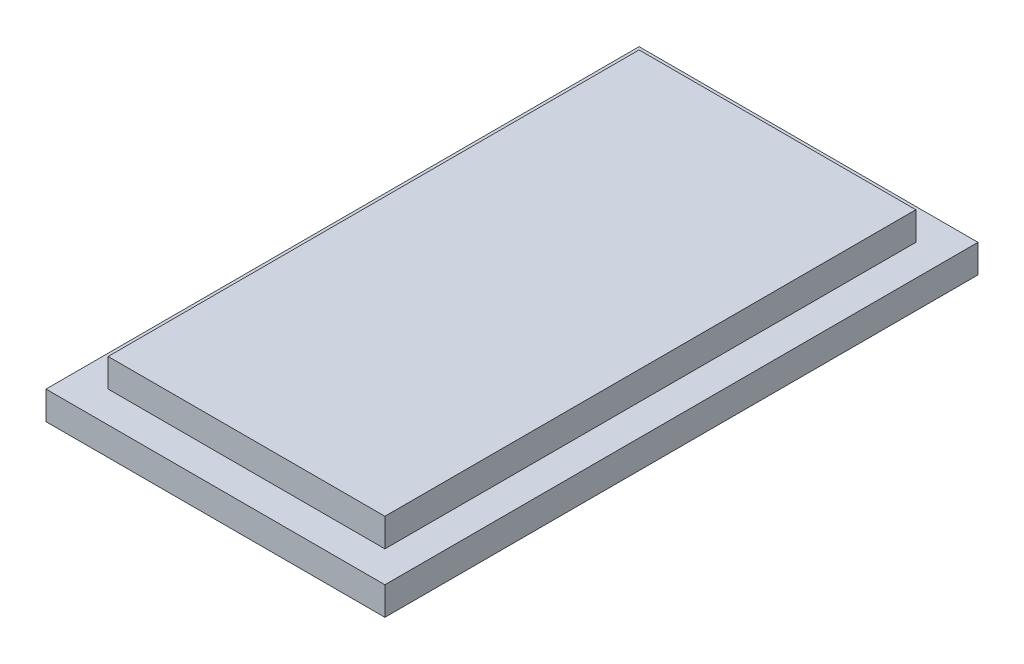
ISO-10303-21;
HEADER;
FILE_DESCRIPTION(('STEP AP214'),'2;1');
FILE_NAME('part.step','',(''),(''),'','','');
FILE_SCHEMA(('AUTOMOTIVE_DESIGN { 1 0 10303 214 1 1 1 1 }'));
ENDSEC;
DATA;
#1=APPLICATION_CONTEXT('core data for automotive mechanical design processes');
#2=APPLICATION_PROTOCOL_DEFINITION('international standard','automotive_design',2000,#1);
#3=PRODUCT_CONTEXT('',#1,'mechanical');
#4=PRODUCT('Part','Part','',(#3));
#5=PRODUCT_RELATED_PRODUCT_CATEGORY('part','',(#4));
#6=PRODUCT_DEFINITION_FORMATION('','',#4);
#7=PRODUCT_DEFINITION_CONTEXT('part definition',#1,'design');
#8=PRODUCT_DEFINITION('design','',#6,#7);
#9=PRODUCT_DEFINITION_SHAPE('','',#8);
#10=(LENGTH_UNIT() NAMED_UNIT(*) SI_UNIT(.MILLI.,.METRE.));
#11=(NAMED_UNIT(*) PLANE_ANGLE_UNIT() SI_UNIT($,.RADIAN.));
#12=(NAMED_UNIT(*) SI_UNIT($,.STERADIAN.) SOLID_ANGLE_UNIT());
#13=UNCERTAINTY_MEASURE_WITH_UNIT(LENGTH_MEASURE(1.E-05),#10,'distance_accuracy_value','');
#14=(GEOMETRIC_REPRESENTATION_CONTEXT(3) GLOBAL_UNCERTAINTY_ASSIGNED_CONTEXT((#13)) GLOBAL_UNIT_ASSIGNED_CONTEXT((#10,
#11,#12)) REPRESENTATION_CONTEXT('',''));
#15=CARTESIAN_POINT('',(0.,0.,0.));
#16=DIRECTION('',(0.,0.,1.));
#17=DIRECTION('',(1.,0.,0.));
#18=AXIS2_PLACEMENT_3D('',#15,#16,#17);
#19=CARTESIAN_POINT('',(0.,3.,0.));
#20=DIRECTION('',(0.,-1.,0.));
#21=DIRECTION('',(0.,0.,-1.));
#22=AXIS2_PLACEMENT_3D('',#19,#20,#21);
#23=PLANE('',#22);
#24=DIRECTION('',(0.,0.,1.));
#25=VECTOR('',#24,1.);
#26=CARTESIAN_POINT('',(0.,3.,0.));
#27=LINE('',#26,#25);
#28=CARTESIAN_POINT('',(0.,3.,-63.));
#29=VERTEX_POINT('',#28);
#30=CARTESIAN_POINT('',(0.,3.,0.));
#31=VERTEX_POINT('',#30);
#32=EDGE_CURVE('E128',#29,#31,#27,.T.);
#33=ORIENTED_EDGE('',*,*,#32,.T.);
#34=DIRECTION('',(1.,0.,0.));
#35=VECTOR('',#34,1.);
#36=CARTESIAN_POINT('',(0.,3.,0.));
#37=LINE('',#36,#35);
#38=CARTESIAN_POINT('',(36.,3.,0.));
#39=VERTEX_POINT('',#38);
#40=EDGE_CURVE('E131',#31,#39,#37,.T.);
#41=ORIENTED_EDGE('',*,*,#40,.T.);
#42=DIRECTION('',(0.,0.,-1.));
#43=VECTOR('',#42,1.);
#44=CARTESIAN_POINT('',(36.,3.,0.));
#45=LINE('',#44,#43);
#46=CARTESIAN_POINT('',(36.,3.,-63.));
#47=VERTEX_POINT('',#46);
#48=EDGE_CURVE('E134',#39,#47,#45,.T.);
#49=ORIENTED_EDGE('',*,*,#48,.T.);
#50=DIRECTION('',(-1.,0.,0.));
#51=VECTOR('',#50,1.);
#52=CARTESIAN_POINT('',(0.,3.,-63.));
#53=LINE('',#52,#51);
#54=EDGE_CURVE('E136',#47,#29,#53,.T.);
#55=ORIENTED_EDGE('',*,*,#54,.T.);
#56=EDGE_LOOP('',(#33,#41,#49,#55));
#57=FACE_BOUND('',#56,.T.);
#58=DIRECTION('',(-1.,0.,0.));
#59=VECTOR('',#58,1.);
#60=CARTESIAN_POINT('',(32.7,3.,-59.7));
#61=LINE('',#60,#59);
#62=CARTESIAN_POINT('',(32.7,3.,-59.7));
#63=VERTEX_POINT('',#62);
#64=CARTESIAN_POINT('',(3.3,3.,-59.7));
#65=VERTEX_POINT('',#64);
#66=EDGE_CURVE('E118',#63,#65,#61,.T.);
#67=ORIENTED_EDGE('',*,*,#66,.F.);
#68=DIRECTION('',(0.,0.,-1.));
#69=VECTOR('',#68,1.);
#70=CARTESIAN_POINT('',(32.7,3.,-3.3));
#71=LINE('',#70,#69);
#72=CARTESIAN_POINT('',(32.7,3.,-3.3));
#73=VERTEX_POINT('',#72);
#74=EDGE_CURVE('E115',#73,#63,#71,.T.);
#75=ORIENTED_EDGE('',*,*,#74,.F.);
#76=DIRECTION('',(1.,0.,0.));
#77=VECTOR('',#76,1.);
#78=CARTESIAN_POINT('',(3.3,3.,-3.3));
#79=LINE('',#78,#77);
#80=CARTESIAN_POINT('',(3.3,3.,-3.3));
#81=VERTEX_POINT('',#80);
#82=EDGE_CURVE('E53',#81,#73,#79,.T.);
#83=ORIENTED_EDGE('',*,*,#82,.F.);
#84=DIRECTION('',(0.,0.,1.));
#85=VECTOR('',#84,1.);
#86=CARTESIAN_POINT('',(3.3,3.,-59.7));
#87=LINE('',#86,#85);
#88=EDGE_CURVE('E48',#65,#81,#87,.T.);
#89=ORIENTED_EDGE('',*,*,#88,.F.);
#90=EDGE_LOOP('',(#67,#75,#83,#89));
#91=FACE_BOUND('',#90,.T.);
#92=ADVANCED_FACE('F33',(#57,#91),#23,.F.);
#93=CARTESIAN_POINT('',(0.,3.,0.));
#94=DIRECTION('',(1.,0.,0.));
#95=DIRECTION('',(0.,0.,-1.));
#96=AXIS2_PLACEMENT_3D('',#93,#94,#95);
#97=PLANE('',#96);
#98=DIRECTION('',(0.,0.,1.));
#99=VECTOR('',#98,1.);
#100=CARTESIAN_POINT('',(0.,0.,0.));
#101=LINE('',#100,#99);
#102=CARTESIAN_POINT('',(0.,0.,-63.));
#103=VERTEX_POINT('',#102);
#104=CARTESIAN_POINT('',(0.,0.,0.));
#105=VERTEX_POINT('',#104);
#106=EDGE_CURVE('E119',#103,#105,#101,.T.);
#107=ORIENTED_EDGE('',*,*,#106,.T.);
#108=DIRECTION('',(0.,-1.,0.));
#109=VECTOR('',#108,1.);
#110=CARTESIAN_POINT('',(0.,3.,0.));
#111=LINE('',#110,#109);
#112=EDGE_CURVE('E11',#31,#105,#111,.T.);
#113=ORIENTED_EDGE('',*,*,#112,.F.);
#114=ORIENTED_EDGE('',*,*,#32,.F.);
#115=DIRECTION('',(0.,-1.,0.));
#116=VECTOR('',#115,1.);
#117=CARTESIAN_POINT('',(0.,3.,-63.));
#118=LINE('',#117,#116);
#119=EDGE_CURVE('E137',#29,#103,#118,.T.);
#120=ORIENTED_EDGE('',*,*,#119,.T.);
#121=EDGE_LOOP('',(#107,#113,#114,#120));
#122=FACE_BOUND('',#121,.T.);
#123=ADVANCED_FACE('F35',(#122),#97,.F.);
#124=CARTESIAN_POINT('',(0.,3.,0.));
#125=DIRECTION('',(0.,0.,-1.));
#126=DIRECTION('',(-1.,0.,0.));
#127=AXIS2_PLACEMENT_3D('',#124,#125,#126);
#128=PLANE('',#127);
#129=DIRECTION('',(1.,0.,0.));
#130=VECTOR('',#129,1.);
#131=CARTESIAN_POINT('',(0.,0.,0.));
#132=LINE('',#131,#130);
#133=CARTESIAN_POINT('',(36.,0.,0.));
#134=VERTEX_POINT('',#133);
#135=EDGE_CURVE('E122',#105,#134,#132,.T.);
#136=ORIENTED_EDGE('',*,*,#135,.T.);
#137=DIRECTION('',(0.,-1.,0.));
#138=VECTOR('',#137,1.);
#139=CARTESIAN_POINT('',(36.,3.,0.));
#140=LINE('',#139,#138);
#141=EDGE_CURVE('E41',#39,#134,#140,.T.);
#142=ORIENTED_EDGE('',*,*,#141,.F.);
#143=ORIENTED_EDGE('',*,*,#40,.F.);
#144=ORIENTED_EDGE('',*,*,#112,.T.);
#145=EDGE_LOOP('',(#136,#142,#143,#144));
#146=FACE_BOUND('',#145,.T.);
#147=ADVANCED_FACE('F167',(#146),#128,.F.);
#148=CARTESIAN_POINT('',(36.,3.,0.));
#149=DIRECTION('',(-1.,0.,0.));
#150=DIRECTION('',(0.,0.,1.));
#151=AXIS2_PLACEMENT_3D('',#148,#149,#150);
#152=PLANE('',#151);
#153=DIRECTION('',(0.,0.,-1.));
#154=VECTOR('',#153,1.);
#155=CARTESIAN_POINT('',(36.,0.,0.));
#156=LINE('',#155,#154);
#157=CARTESIAN_POINT('',(36.,0.,-63.));
#158=VERTEX_POINT('',#157);
#159=EDGE_CURVE('E140',#134,#158,#156,.T.);
#160=ORIENTED_EDGE('',*,*,#159,.T.);
#161=DIRECTION('',(0.,-1.,0.));
#162=VECTOR('',#161,1.);
#163=CARTESIAN_POINT('',(36.,3.,-63.));
#164=LINE('',#163,#162);
#165=EDGE_CURVE('E145',#47,#158,#164,.T.);
#166=ORIENTED_EDGE('',*,*,#165,.F.);
#167=ORIENTED_EDGE('',*,*,#48,.F.);
#168=ORIENTED_EDGE('',*,*,#141,.T.);
#169=EDGE_LOOP('',(#160,#166,#167,#168));
#170=FACE_BOUND('',#169,.T.);
#171=ADVANCED_FACE('F152',(#170),#152,.F.);
#172=CARTESIAN_POINT('',(0.,3.,-63.));
#173=DIRECTION('',(0.,0.,1.));
#174=DIRECTION('',(1.,0.,0.));
#175=AXIS2_PLACEMENT_3D('',#172,#173,#174);
#176=PLANE('',#175);
#177=DIRECTION('',(-1.,0.,0.));
#178=VECTOR('',#177,1.);
#179=CARTESIAN_POINT('',(0.,0.,-63.));
#180=LINE('',#179,#178);
#181=EDGE_CURVE('E132',#158,#103,#180,.T.);
#182=ORIENTED_EDGE('',*,*,#181,.T.);
#183=ORIENTED_EDGE('',*,*,#119,.F.);
#184=ORIENTED_EDGE('',*,*,#54,.F.);
#185=ORIENTED_EDGE('',*,*,#165,.T.);
#186=EDGE_LOOP('',(#182,#183,#184,#185));
#187=FACE_BOUND('',#186,.T.);
#188=ADVANCED_FACE('F161',(#187),#176,.F.);
#189=CARTESIAN_POINT('',(0.,0.,0.));
#190=DIRECTION('',(0.,-1.,0.));
#191=DIRECTION('',(0.,0.,-1.));
#192=AXIS2_PLACEMENT_3D('',#189,#190,#191);
#193=PLANE('',#192);
#194=ORIENTED_EDGE('',*,*,#106,.F.);
#195=ORIENTED_EDGE('',*,*,#181,.F.);
#196=ORIENTED_EDGE('',*,*,#159,.F.);
#197=ORIENTED_EDGE('',*,*,#135,.F.);
#198=EDGE_LOOP('',(#194,#195,#196,#197));
#199=FACE_BOUND('',#198,.T.);
#200=ADVANCED_FACE('F158',(#199),#193,.T.);
#201=CARTESIAN_POINT('',(32.7,6.,-59.7));
#202=DIRECTION('',(0.,0.,1.));
#203=DIRECTION('',(1.,0.,0.));
#204=AXIS2_PLACEMENT_3D('',#201,#202,#203);
#205=PLANE('',#204);
#206=ORIENTED_EDGE('',*,*,#66,.T.);
#207=DIRECTION('',(0.,-1.,0.));
#208=VECTOR('',#207,1.);
#209=CARTESIAN_POINT('',(3.3,6.,-59.7));
#210=LINE('',#209,#208);
#211=CARTESIAN_POINT('',(3.3,6.,-59.7));
#212=VERTEX_POINT('',#211);
#213=EDGE_CURVE('E99',#212,#65,#210,.T.);
#214=ORIENTED_EDGE('',*,*,#213,.F.);
#215=DIRECTION('',(-1.,0.,0.));
#216=VECTOR('',#215,1.);
#217=CARTESIAN_POINT('',(32.7,6.,-59.7));
#218=LINE('',#217,#216);
#219=CARTESIAN_POINT('',(32.7,6.,-59.7));
#220=VERTEX_POINT('',#219);
#221=EDGE_CURVE('E106',#220,#212,#218,.T.);
#222=ORIENTED_EDGE('',*,*,#221,.F.);
#223=DIRECTION('',(0.,-1.,0.));
#224=VECTOR('',#223,1.);
#225=CARTESIAN_POINT('',(32.7,6.,-59.7));
#226=LINE('',#225,#224);
#227=EDGE_CURVE('E260',#220,#63,#226,.T.);
#228=ORIENTED_EDGE('',*,*,#227,.T.);
#229=EDGE_LOOP('',(#206,#214,#222,#228));
#230=FACE_BOUND('',#229,.T.);
#231=ADVANCED_FACE('F117',(#230),#205,.F.);
#232=CARTESIAN_POINT('',(3.3,6.,-59.7));
#233=DIRECTION('',(1.,0.,0.));
#234=DIRECTION('',(0.,0.,-1.));
#235=AXIS2_PLACEMENT_3D('',#232,#233,#234);
#236=PLANE('',#235);
#237=ORIENTED_EDGE('',*,*,#88,.T.);
#238=DIRECTION('',(0.,-1.,0.));
#239=VECTOR('',#238,1.);
#240=CARTESIAN_POINT('',(3.3,6.,-3.3));
#241=LINE('',#240,#239);
#242=CARTESIAN_POINT('',(3.3,6.,-3.3));
#243=VERTEX_POINT('',#242);
#244=EDGE_CURVE('E102',#243,#81,#241,.T.);
#245=ORIENTED_EDGE('',*,*,#244,.F.);
#246=DIRECTION('',(0.,0.,1.));
#247=VECTOR('',#246,1.);
#248=CARTESIAN_POINT('',(3.3,6.,-59.7));
#249=LINE('',#248,#247);
#250=EDGE_CURVE('E95',#212,#243,#249,.T.);
#251=ORIENTED_EDGE('',*,*,#250,.F.);
#252=ORIENTED_EDGE('',*,*,#213,.T.);
#253=EDGE_LOOP('',(#237,#245,#251,#252));
#254=FACE_BOUND('',#253,.T.);
#255=ADVANCED_FACE('F97',(#254),#236,.F.);
#256=CARTESIAN_POINT('',(3.3,6.,-3.3));
#257=DIRECTION('',(0.,0.,-1.));
#258=DIRECTION('',(-1.,0.,0.));
#259=AXIS2_PLACEMENT_3D('',#256,#257,#258);
#260=PLANE('',#259);
#261=ORIENTED_EDGE('',*,*,#82,.T.);
#262=DIRECTION('',(0.,-1.,0.));
#263=VECTOR('',#262,1.);
#264=CARTESIAN_POINT('',(32.7,6.,-3.3));
#265=LINE('',#264,#263);
#266=CARTESIAN_POINT('',(32.7,6.,-3.3));
#267=VERTEX_POINT('',#266);
#268=EDGE_CURVE('E124',#267,#73,#265,.T.);
#269=ORIENTED_EDGE('',*,*,#268,.F.);
#270=DIRECTION('',(1.,0.,0.));
#271=VECTOR('',#270,1.);
#272=CARTESIAN_POINT('',(3.3,6.,-3.3));
#273=LINE('',#272,#271);
#274=EDGE_CURVE('E105',#243,#267,#273,.T.);
#275=ORIENTED_EDGE('',*,*,#274,.F.);
#276=ORIENTED_EDGE('',*,*,#244,.T.);
#277=EDGE_LOOP('',(#261,#269,#275,#276));
#278=FACE_BOUND('',#277,.T.);
#279=ADVANCED_FACE('F203',(#278),#260,.F.);
#280=CARTESIAN_POINT('',(32.7,6.,-3.3));
#281=DIRECTION('',(-1.,0.,0.));
#282=DIRECTION('',(0.,0.,1.));
#283=AXIS2_PLACEMENT_3D('',#280,#281,#282);
#284=PLANE('',#283);
#285=ORIENTED_EDGE('',*,*,#74,.T.);
#286=ORIENTED_EDGE('',*,*,#227,.F.);
#287=DIRECTION('',(0.,0.,-1.));
#288=VECTOR('',#287,1.);
#289=CARTESIAN_POINT('',(32.7,6.,-3.3));
#290=LINE('',#289,#288);
#291=EDGE_CURVE('E111',#267,#220,#290,.T.);
#292=ORIENTED_EDGE('',*,*,#291,.F.);
#293=ORIENTED_EDGE('',*,*,#268,.T.);
#294=EDGE_LOOP('',(#285,#286,#292,#293));
#295=FACE_BOUND('',#294,.T.);
#296=ADVANCED_FACE('F209',(#295),#284,.F.);
#297=CARTESIAN_POINT('',(0.,6.,0.));
#298=DIRECTION('',(0.,1.,0.));
#299=DIRECTION('',(0.,0.,1.));
#300=AXIS2_PLACEMENT_3D('',#297,#298,#299);
#301=PLANE('',#300);
#302=ORIENTED_EDGE('',*,*,#221,.T.);
#303=ORIENTED_EDGE('',*,*,#250,.T.);
#304=ORIENTED_EDGE('',*,*,#274,.T.);
#305=ORIENTED_EDGE('',*,*,#291,.T.);
#306=EDGE_LOOP('',(#302,#303,#304,#305));
#307=FACE_BOUND('',#306,.T.);
#308=ADVANCED_FACE('F109',(#307),#301,.T.);
#309=CLOSED_SHELL('',(#92,#123,#147,#171,#188,#200,#231,#255,#279,#296,#308));
#310=MANIFOLD_SOLID_BREP('B2',#309);
#311=ADVANCED_BREP_SHAPE_REPRESENTATION('',(#18,#310),#14);
#312=SHAPE_DEFINITION_REPRESENTATION(#9,#311);
ENDSEC;
END-ISO-10303-21;
